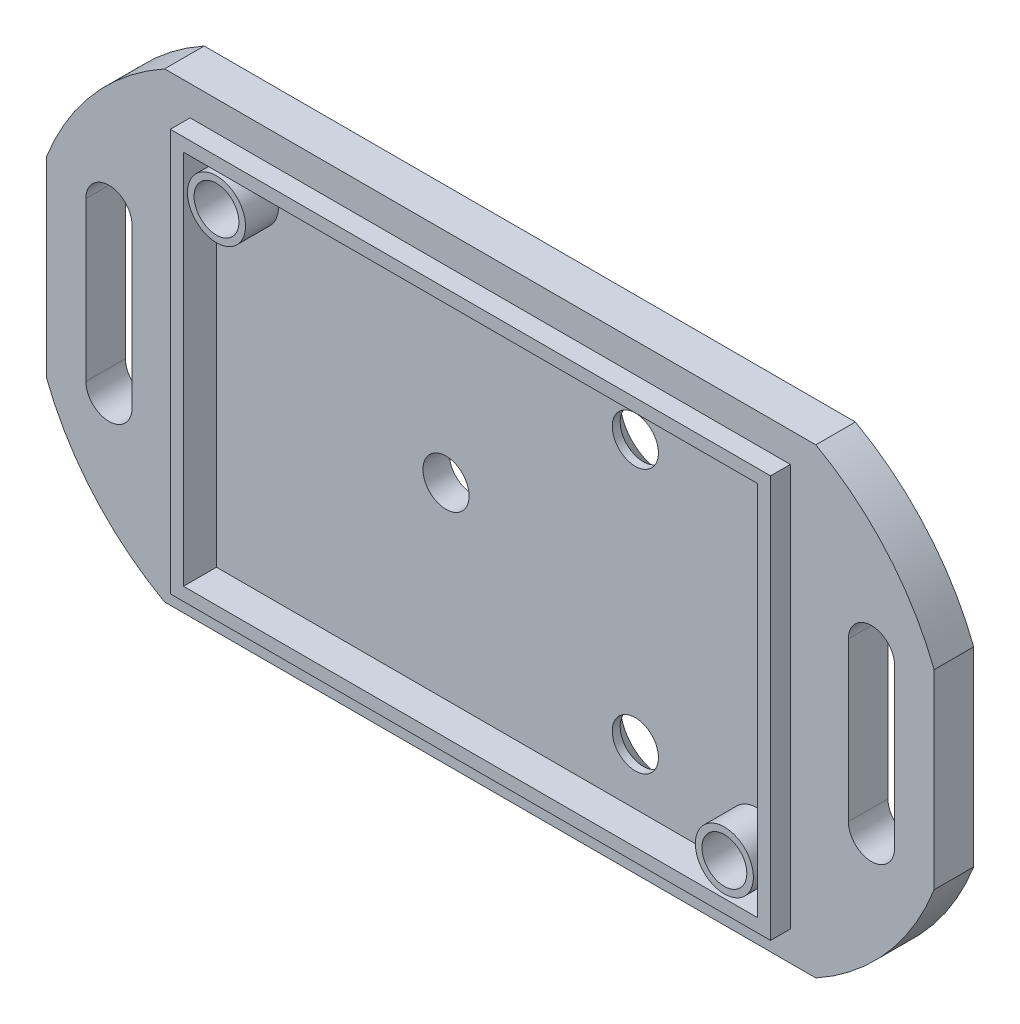
ISO-10303-21;
HEADER;
FILE_DESCRIPTION(('STEP AP214'),'2;1');
FILE_NAME('part.step','',(''),(''),'','','');
FILE_SCHEMA(('AUTOMOTIVE_DESIGN { 1 0 10303 214 1 1 1 1 }'));
ENDSEC;
DATA;
#1=APPLICATION_CONTEXT('core data for automotive mechanical design processes');
#2=APPLICATION_PROTOCOL_DEFINITION('international standard','automotive_design',2000,#1);
#3=PRODUCT_CONTEXT('',#1,'mechanical');
#4=PRODUCT('Part','Part','',(#3));
#5=PRODUCT_RELATED_PRODUCT_CATEGORY('part','',(#4));
#6=PRODUCT_DEFINITION_FORMATION('','',#4);
#7=PRODUCT_DEFINITION_CONTEXT('part definition',#1,'design');
#8=PRODUCT_DEFINITION('design','',#6,#7);
#9=PRODUCT_DEFINITION_SHAPE('','',#8);
#10=(LENGTH_UNIT() NAMED_UNIT(*) SI_UNIT(.MILLI.,.METRE.));
#11=(NAMED_UNIT(*) PLANE_ANGLE_UNIT() SI_UNIT($,.RADIAN.));
#12=(NAMED_UNIT(*) SI_UNIT($,.STERADIAN.) SOLID_ANGLE_UNIT());
#13=UNCERTAINTY_MEASURE_WITH_UNIT(LENGTH_MEASURE(1.E-05),#10,'distance_accuracy_value','');
#14=(GEOMETRIC_REPRESENTATION_CONTEXT(3) GLOBAL_UNCERTAINTY_ASSIGNED_CONTEXT((#13)) GLOBAL_UNIT_ASSIGNED_CONTEXT((#10,
#11,#12)) REPRESENTATION_CONTEXT('',''));
#15=CARTESIAN_POINT('',(0.,0.,0.));
#16=DIRECTION('',(0.,0.,1.));
#17=DIRECTION('',(1.,0.,0.));
#18=AXIS2_PLACEMENT_3D('',#15,#16,#17);
#19=CARTESIAN_POINT('',(0.,0.,2.));
#20=DIRECTION('',(0.,0.,1.));
#21=DIRECTION('',(1.,0.,0.));
#22=AXIS2_PLACEMENT_3D('',#19,#20,#21);
#23=PLANE('',#22);
#24=CARTESIAN_POINT('',(-4.34999999999999,0.,2.));
#25=DIRECTION('',(0.,0.,1.));
#26=DIRECTION('',(1.,0.,0.));
#27=AXIS2_PLACEMENT_3D('',#24,#25,#26);
#28=CIRCLE('',#27,1.75);
#29=CARTESIAN_POINT('',(-2.59999999999999,0.,2.));
#30=VERTEX_POINT('',#29);
#31=EDGE_CURVE('E427',#30,#30,#28,.T.);
#32=ORIENTED_EDGE('',*,*,#31,.F.);
#33=EDGE_LOOP('',(#32));
#34=FACE_BOUND('',#33,.T.);
#35=CARTESIAN_POINT('',(10.,-10.,2.));
#36=DIRECTION('',(0.,0.,1.));
#37=DIRECTION('',(1.,0.,0.));
#38=AXIS2_PLACEMENT_3D('',#35,#36,#37);
#39=CIRCLE('',#38,1.75);
#40=CARTESIAN_POINT('',(11.75,-10.,2.));
#41=VERTEX_POINT('',#40);
#42=EDGE_CURVE('E38',#41,#41,#39,.T.);
#43=ORIENTED_EDGE('',*,*,#42,.F.);
#44=EDGE_LOOP('',(#43));
#45=FACE_BOUND('',#44,.T.);
#46=CARTESIAN_POINT('',(10.,10.,2.));
#47=DIRECTION('',(0.,0.,1.));
#48=DIRECTION('',(1.,0.,0.));
#49=AXIS2_PLACEMENT_3D('',#46,#47,#48);
#50=CIRCLE('',#49,1.75);
#51=CARTESIAN_POINT('',(11.75,10.,2.));
#52=VERTEX_POINT('',#51);
#53=EDGE_CURVE('E405',#52,#52,#50,.T.);
#54=ORIENTED_EDGE('',*,*,#53,.F.);
#55=EDGE_LOOP('',(#54));
#56=FACE_BOUND('',#55,.T.);
#57=CARTESIAN_POINT('',(-19.25,11.75,2.));
#58=DIRECTION('',(0.,0.,1.));
#59=DIRECTION('',(1.,0.,0.));
#60=AXIS2_PLACEMENT_3D('',#57,#58,#59);
#61=CIRCLE('',#60,2.2);
#62=CARTESIAN_POINT('',(-17.05,11.75,2.));
#63=VERTEX_POINT('',#62);
#64=EDGE_CURVE('E273',#63,#63,#61,.T.);
#65=ORIENTED_EDGE('',*,*,#64,.F.);
#66=EDGE_LOOP('',(#65));
#67=FACE_BOUND('',#66,.T.);
#68=DIRECTION('',(0.,-1.,0.));
#69=VECTOR('',#68,1.);
#70=CARTESIAN_POINT('',(-21.75,14.25,2.));
#71=LINE('',#70,#69);
#72=CARTESIAN_POINT('',(-21.75,14.25,2.));
#73=VERTEX_POINT('',#72);
#74=CARTESIAN_POINT('',(-21.75,-14.25,2.));
#75=VERTEX_POINT('',#74);
#76=EDGE_CURVE('E292',#73,#75,#71,.T.);
#77=ORIENTED_EDGE('',*,*,#76,.T.);
#78=DIRECTION('',(1.,0.,0.));
#79=VECTOR('',#78,1.);
#80=CARTESIAN_POINT('',(-21.75,-14.25,2.));
#81=LINE('',#80,#79);
#82=CARTESIAN_POINT('',(21.75,-14.25,2.));
#83=VERTEX_POINT('',#82);
#84=EDGE_CURVE('E295',#75,#83,#81,.T.);
#85=ORIENTED_EDGE('',*,*,#84,.T.);
#86=DIRECTION('',(0.,1.,0.));
#87=VECTOR('',#86,1.);
#88=CARTESIAN_POINT('',(21.75,14.25,2.));
#89=LINE('',#88,#87);
#90=CARTESIAN_POINT('',(21.75,14.25,2.));
#91=VERTEX_POINT('',#90);
#92=EDGE_CURVE('E299',#83,#91,#89,.T.);
#93=ORIENTED_EDGE('',*,*,#92,.T.);
#94=DIRECTION('',(-1.,0.,0.));
#95=VECTOR('',#94,1.);
#96=CARTESIAN_POINT('',(-21.75,14.25,2.));
#97=LINE('',#96,#95);
#98=EDGE_CURVE('E302',#91,#73,#97,.T.);
#99=ORIENTED_EDGE('',*,*,#98,.T.);
#100=EDGE_LOOP('',(#77,#85,#93,#99));
#101=FACE_BOUND('',#100,.T.);
#102=CARTESIAN_POINT('',(19.25,-11.75,2.));
#103=DIRECTION('',(0.,0.,1.));
#104=DIRECTION('',(1.,0.,0.));
#105=AXIS2_PLACEMENT_3D('',#102,#103,#104);
#106=CIRCLE('',#105,2.2);
#107=CARTESIAN_POINT('',(21.45,-11.75,2.));
#108=VERTEX_POINT('',#107);
#109=EDGE_CURVE('E264',#108,#108,#106,.T.);
#110=ORIENTED_EDGE('',*,*,#109,.F.);
#111=EDGE_LOOP('',(#110));
#112=FACE_BOUND('',#111,.T.);
#113=ADVANCED_FACE('F34',(#34,#45,#56,#67,#101,#112),#23,.T.);
#114=CARTESIAN_POINT('',(15.,0.,3.));
#115=DIRECTION('',(0.,0.,1.));
#116=DIRECTION('',(1.,0.,0.));
#117=AXIS2_PLACEMENT_3D('',#114,#115,#116);
#118=PLANE('',#117);
#119=CARTESIAN_POINT('',(-28.9,6.,3.));
#120=DIRECTION('',(0.,0.,1.));
#121=DIRECTION('',(1.,0.,0.));
#122=AXIS2_PLACEMENT_3D('',#119,#120,#121);
#123=CIRCLE('',#122,1.75);
#124=CARTESIAN_POINT('',(-27.15,6.,3.));
#125=VERTEX_POINT('',#124);
#126=CARTESIAN_POINT('',(-30.65,6.,3.));
#127=VERTEX_POINT('',#126);
#128=EDGE_CURVE('E230',#125,#127,#123,.T.);
#129=ORIENTED_EDGE('',*,*,#128,.F.);
#130=DIRECTION('',(0.,1.,0.));
#131=VECTOR('',#130,1.);
#132=CARTESIAN_POINT('',(-27.15,0.,3.));
#133=LINE('',#132,#131);
#134=CARTESIAN_POINT('',(-27.15,-6.,3.));
#135=VERTEX_POINT('',#134);
#136=EDGE_CURVE('E223',#135,#125,#133,.T.);
#137=ORIENTED_EDGE('',*,*,#136,.F.);
#138=CARTESIAN_POINT('',(-28.9,-6.,3.));
#139=DIRECTION('',(0.,0.,1.));
#140=DIRECTION('',(1.,0.,0.));
#141=AXIS2_PLACEMENT_3D('',#138,#139,#140);
#142=CIRCLE('',#141,1.75);
#143=CARTESIAN_POINT('',(-30.65,-6.,3.));
#144=VERTEX_POINT('',#143);
#145=EDGE_CURVE('E203',#144,#135,#142,.T.);
#146=ORIENTED_EDGE('',*,*,#145,.F.);
#147=DIRECTION('',(0.,-1.,0.));
#148=VECTOR('',#147,1.);
#149=CARTESIAN_POINT('',(-30.65,0.,3.));
#150=LINE('',#149,#148);
#151=EDGE_CURVE('E228',#127,#144,#150,.T.);
#152=ORIENTED_EDGE('',*,*,#151,.F.);
#153=EDGE_LOOP('',(#129,#137,#146,#152));
#154=FACE_BOUND('',#153,.T.);
#155=CARTESIAN_POINT('',(28.9,6.,3.));
#156=DIRECTION('',(0.,0.,1.));
#157=DIRECTION('',(1.,0.,0.));
#158=AXIS2_PLACEMENT_3D('',#155,#156,#157);
#159=CIRCLE('',#158,1.75);
#160=CARTESIAN_POINT('',(30.65,6.,3.));
#161=VERTEX_POINT('',#160);
#162=CARTESIAN_POINT('',(27.15,6.,3.));
#163=VERTEX_POINT('',#162);
#164=EDGE_CURVE('E259',#161,#163,#159,.T.);
#165=ORIENTED_EDGE('',*,*,#164,.F.);
#166=DIRECTION('',(0.,1.,0.));
#167=VECTOR('',#166,1.);
#168=CARTESIAN_POINT('',(30.65,0.,3.));
#169=LINE('',#168,#167);
#170=CARTESIAN_POINT('',(30.65,-6.,3.));
#171=VERTEX_POINT('',#170);
#172=EDGE_CURVE('E246',#171,#161,#169,.T.);
#173=ORIENTED_EDGE('',*,*,#172,.F.);
#174=CARTESIAN_POINT('',(28.9,-6.,3.));
#175=DIRECTION('',(0.,0.,1.));
#176=DIRECTION('',(1.,0.,0.));
#177=AXIS2_PLACEMENT_3D('',#174,#175,#176);
#178=CIRCLE('',#177,1.75);
#179=CARTESIAN_POINT('',(27.15,-6.,3.));
#180=VERTEX_POINT('',#179);
#181=EDGE_CURVE('E254',#180,#171,#178,.T.);
#182=ORIENTED_EDGE('',*,*,#181,.F.);
#183=DIRECTION('',(0.,-1.,0.));
#184=VECTOR('',#183,1.);
#185=CARTESIAN_POINT('',(27.15,0.,3.));
#186=LINE('',#185,#184);
#187=EDGE_CURVE('E257',#163,#180,#186,.T.);
#188=ORIENTED_EDGE('',*,*,#187,.F.);
#189=EDGE_LOOP('',(#165,#173,#182,#188));
#190=FACE_BOUND('',#189,.T.);
#191=CARTESIAN_POINT('',(15.,0.,3.));
#192=DIRECTION('',(0.,0.,1.));
#193=DIRECTION('',(1.,0.,0.));
#194=AXIS2_PLACEMENT_3D('',#191,#192,#193);
#195=CIRCLE('',#194,20.);
#196=CARTESIAN_POINT('',(24.6824583655185,-17.5,3.));
#197=VERTEX_POINT('',#196);
#198=CARTESIAN_POINT('',(33.65,-7.22339947670067,3.));
#199=VERTEX_POINT('',#198);
#200=EDGE_CURVE('E353',#197,#199,#195,.T.);
#201=ORIENTED_EDGE('',*,*,#200,.T.);
#202=DIRECTION('',(0.,1.,0.));
#203=VECTOR('',#202,1.);
#204=CARTESIAN_POINT('',(33.65,7.22339947670068,3.));
#205=LINE('',#204,#203);
#206=CARTESIAN_POINT('',(33.65,7.22339947670068,3.));
#207=VERTEX_POINT('',#206);
#208=EDGE_CURVE('E356',#199,#207,#205,.T.);
#209=ORIENTED_EDGE('',*,*,#208,.T.);
#210=CARTESIAN_POINT('',(15.,0.,3.));
#211=DIRECTION('',(0.,0.,1.));
#212=DIRECTION('',(1.,0.,0.));
#213=AXIS2_PLACEMENT_3D('',#210,#211,#212);
#214=CIRCLE('',#213,20.);
#215=CARTESIAN_POINT('',(24.6824583655185,17.5,3.));
#216=VERTEX_POINT('',#215);
#217=EDGE_CURVE('E359',#207,#216,#214,.T.);
#218=ORIENTED_EDGE('',*,*,#217,.T.);
#219=DIRECTION('',(-1.,0.,0.));
#220=VECTOR('',#219,1.);
#221=CARTESIAN_POINT('',(-24.6824583655185,17.5,3.));
#222=LINE('',#221,#220);
#223=CARTESIAN_POINT('',(-24.6824583655185,17.5,3.));
#224=VERTEX_POINT('',#223);
#225=EDGE_CURVE('E361',#216,#224,#222,.T.);
#226=ORIENTED_EDGE('',*,*,#225,.T.);
#227=CARTESIAN_POINT('',(-15.,0.,3.));
#228=DIRECTION('',(0.,0.,1.));
#229=DIRECTION('',(1.,0.,0.));
#230=AXIS2_PLACEMENT_3D('',#227,#228,#229);
#231=CIRCLE('',#230,20.);
#232=CARTESIAN_POINT('',(-33.65,7.22339947670071,3.));
#233=VERTEX_POINT('',#232);
#234=EDGE_CURVE('E363',#224,#233,#231,.T.);
#235=ORIENTED_EDGE('',*,*,#234,.T.);
#236=DIRECTION('',(0.,-1.,0.));
#237=VECTOR('',#236,1.);
#238=CARTESIAN_POINT('',(-33.65,7.22339947670071,3.));
#239=LINE('',#238,#237);
#240=CARTESIAN_POINT('',(-33.65,-7.22339947670074,3.));
#241=VERTEX_POINT('',#240);
#242=EDGE_CURVE('E365',#233,#241,#239,.T.);
#243=ORIENTED_EDGE('',*,*,#242,.T.);
#244=CARTESIAN_POINT('',(-15.,0.,3.));
#245=DIRECTION('',(0.,0.,1.));
#246=DIRECTION('',(1.,0.,0.));
#247=AXIS2_PLACEMENT_3D('',#244,#245,#246);
#248=CIRCLE('',#247,20.);
#249=CARTESIAN_POINT('',(-24.6824583655185,-17.5,3.));
#250=VERTEX_POINT('',#249);
#251=EDGE_CURVE('E367',#241,#250,#248,.T.);
#252=ORIENTED_EDGE('',*,*,#251,.T.);
#253=DIRECTION('',(1.,0.,0.));
#254=VECTOR('',#253,1.);
#255=CARTESIAN_POINT('',(-24.6824583655185,-17.5,3.));
#256=LINE('',#255,#254);
#257=EDGE_CURVE('E369',#250,#197,#256,.T.);
#258=ORIENTED_EDGE('',*,*,#257,.T.);
#259=EDGE_LOOP('',(#201,#209,#218,#226,#235,#243,#252,#258));
#260=FACE_BOUND('',#259,.T.);
#261=DIRECTION('',(1.,0.,0.));
#262=VECTOR('',#261,1.);
#263=CARTESIAN_POINT('',(-22.75,-15.25,3.));
#264=LINE('',#263,#262);
#265=CARTESIAN_POINT('',(-22.75,-15.25,3.));
#266=VERTEX_POINT('',#265);
#267=CARTESIAN_POINT('',(22.75,-15.25,3.));
#268=VERTEX_POINT('',#267);
#269=EDGE_CURVE('E337',#266,#268,#264,.T.);
#270=ORIENTED_EDGE('',*,*,#269,.F.);
#271=DIRECTION('',(0.,-1.,0.));
#272=VECTOR('',#271,1.);
#273=CARTESIAN_POINT('',(-22.75,15.25,3.));
#274=LINE('',#273,#272);
#275=CARTESIAN_POINT('',(-22.75,15.25,3.));
#276=VERTEX_POINT('',#275);
#277=EDGE_CURVE('E317',#276,#266,#274,.T.);
#278=ORIENTED_EDGE('',*,*,#277,.F.);
#279=DIRECTION('',(-1.,0.,0.));
#280=VECTOR('',#279,1.);
#281=CARTESIAN_POINT('',(-22.75,15.25,3.));
#282=LINE('',#281,#280);
#283=CARTESIAN_POINT('',(22.75,15.25,3.));
#284=VERTEX_POINT('',#283);
#285=EDGE_CURVE('E328',#284,#276,#282,.T.);
#286=ORIENTED_EDGE('',*,*,#285,.F.);
#287=DIRECTION('',(0.,1.,0.));
#288=VECTOR('',#287,1.);
#289=CARTESIAN_POINT('',(22.75,15.25,3.));
#290=LINE('',#289,#288);
#291=EDGE_CURVE('E339',#268,#284,#290,.T.);
#292=ORIENTED_EDGE('',*,*,#291,.F.);
#293=EDGE_LOOP('',(#270,#278,#286,#292));
#294=FACE_BOUND('',#293,.T.);
#295=ADVANCED_FACE('F436',(#154,#190,#260,#294),#118,.T.);
#296=CARTESIAN_POINT('',(15.,0.,3.));
#297=DIRECTION('',(0.,0.,-1.));
#298=DIRECTION('',(-1.,0.,0.));
#299=AXIS2_PLACEMENT_3D('',#296,#297,#298);
#300=CYLINDRICAL_SURFACE('',#299,20.);
#301=CARTESIAN_POINT('',(15.,0.,0.));
#302=DIRECTION('',(0.,0.,1.));
#303=DIRECTION('',(1.,0.,0.));
#304=AXIS2_PLACEMENT_3D('',#301,#302,#303);
#305=CIRCLE('',#304,20.);
#306=CARTESIAN_POINT('',(24.6824583655185,-17.5,0.));
#307=VERTEX_POINT('',#306);
#308=CARTESIAN_POINT('',(33.65,-7.22339947670067,0.));
#309=VERTEX_POINT('',#308);
#310=EDGE_CURVE('E352',#307,#309,#305,.T.);
#311=ORIENTED_EDGE('',*,*,#310,.T.);
#312=DIRECTION('',(0.,0.,-1.));
#313=VECTOR('',#312,1.);
#314=CARTESIAN_POINT('',(33.65,-7.22339947670067,3.));
#315=LINE('',#314,#313);
#316=EDGE_CURVE('E11',#199,#309,#315,.T.);
#317=ORIENTED_EDGE('',*,*,#316,.F.);
#318=ORIENTED_EDGE('',*,*,#200,.F.);
#319=DIRECTION('',(0.,0.,-1.));
#320=VECTOR('',#319,1.);
#321=CARTESIAN_POINT('',(24.6824583655185,-17.5,3.));
#322=LINE('',#321,#320);
#323=EDGE_CURVE('E371',#197,#307,#322,.T.);
#324=ORIENTED_EDGE('',*,*,#323,.T.);
#325=EDGE_LOOP('',(#311,#317,#318,#324));
#326=FACE_BOUND('',#325,.T.);
#327=ADVANCED_FACE('F36',(#326),#300,.T.);
#328=CARTESIAN_POINT('',(33.65,7.22339947670068,3.));
#329=DIRECTION('',(-1.,0.,0.));
#330=DIRECTION('',(0.,0.,1.));
#331=AXIS2_PLACEMENT_3D('',#328,#329,#330);
#332=PLANE('',#331);
#333=DIRECTION('',(0.,1.,0.));
#334=VECTOR('',#333,1.);
#335=CARTESIAN_POINT('',(33.65,7.22339947670068,0.));
#336=LINE('',#335,#334);
#337=CARTESIAN_POINT('',(33.65,7.22339947670068,0.));
#338=VERTEX_POINT('',#337);
#339=EDGE_CURVE('E374',#309,#338,#336,.T.);
#340=ORIENTED_EDGE('',*,*,#339,.T.);
#341=DIRECTION('',(0.,0.,-1.));
#342=VECTOR('',#341,1.);
#343=CARTESIAN_POINT('',(33.65,7.22339947670068,3.));
#344=LINE('',#343,#342);
#345=EDGE_CURVE('E43',#207,#338,#344,.T.);
#346=ORIENTED_EDGE('',*,*,#345,.F.);
#347=ORIENTED_EDGE('',*,*,#208,.F.);
#348=ORIENTED_EDGE('',*,*,#316,.T.);
#349=EDGE_LOOP('',(#340,#346,#347,#348));
#350=FACE_BOUND('',#349,.T.);
#351=ADVANCED_FACE('F553',(#350),#332,.F.);
#352=CARTESIAN_POINT('',(15.,0.,3.));
#353=DIRECTION('',(0.,0.,-1.));
#354=DIRECTION('',(-1.,0.,0.));
#355=AXIS2_PLACEMENT_3D('',#352,#353,#354);
#356=CYLINDRICAL_SURFACE('',#355,20.);
#357=CARTESIAN_POINT('',(15.,0.,0.));
#358=DIRECTION('',(0.,0.,1.));
#359=DIRECTION('',(1.,0.,0.));
#360=AXIS2_PLACEMENT_3D('',#357,#358,#359);
#361=CIRCLE('',#360,20.);
#362=CARTESIAN_POINT('',(24.6824583655185,17.5,0.));
#363=VERTEX_POINT('',#362);
#364=EDGE_CURVE('E376',#338,#363,#361,.T.);
#365=ORIENTED_EDGE('',*,*,#364,.T.);
#366=DIRECTION('',(0.,0.,-1.));
#367=VECTOR('',#366,1.);
#368=CARTESIAN_POINT('',(24.6824583655185,17.5,3.));
#369=LINE('',#368,#367);
#370=EDGE_CURVE('E401',#216,#363,#369,.T.);
#371=ORIENTED_EDGE('',*,*,#370,.F.);
#372=ORIENTED_EDGE('',*,*,#217,.F.);
#373=ORIENTED_EDGE('',*,*,#345,.T.);
#374=EDGE_LOOP('',(#365,#371,#372,#373));
#375=FACE_BOUND('',#374,.T.);
#376=ADVANCED_FACE('F550',(#375),#356,.T.);
#377=CARTESIAN_POINT('',(-24.6824583655185,17.5,3.));
#378=DIRECTION('',(0.,-1.,0.));
#379=DIRECTION('',(0.,0.,-1.));
#380=AXIS2_PLACEMENT_3D('',#377,#378,#379);
#381=PLANE('',#380);
#382=DIRECTION('',(-1.,0.,0.));
#383=VECTOR('',#382,1.);
#384=CARTESIAN_POINT('',(-24.6824583655185,17.5,0.));
#385=LINE('',#384,#383);
#386=CARTESIAN_POINT('',(-24.6824583655185,17.5,0.));
#387=VERTEX_POINT('',#386);
#388=EDGE_CURVE('E378',#363,#387,#385,.T.);
#389=ORIENTED_EDGE('',*,*,#388,.T.);
#390=DIRECTION('',(0.,0.,-1.));
#391=VECTOR('',#390,1.);
#392=CARTESIAN_POINT('',(-24.6824583655185,17.5,3.));
#393=LINE('',#392,#391);
#394=EDGE_CURVE('E398',#224,#387,#393,.T.);
#395=ORIENTED_EDGE('',*,*,#394,.F.);
#396=ORIENTED_EDGE('',*,*,#225,.F.);
#397=ORIENTED_EDGE('',*,*,#370,.T.);
#398=EDGE_LOOP('',(#389,#395,#396,#397));
#399=FACE_BOUND('',#398,.T.);
#400=ADVANCED_FACE('F546',(#399),#381,.F.);
#401=CARTESIAN_POINT('',(-15.,0.,3.));
#402=DIRECTION('',(0.,0.,-1.));
#403=DIRECTION('',(-1.,0.,0.));
#404=AXIS2_PLACEMENT_3D('',#401,#402,#403);
#405=CYLINDRICAL_SURFACE('',#404,20.);
#406=CARTESIAN_POINT('',(-15.,0.,0.));
#407=DIRECTION('',(0.,0.,1.));
#408=DIRECTION('',(1.,0.,0.));
#409=AXIS2_PLACEMENT_3D('',#406,#407,#408);
#410=CIRCLE('',#409,20.);
#411=CARTESIAN_POINT('',(-33.65,7.22339947670071,0.));
#412=VERTEX_POINT('',#411);
#413=EDGE_CURVE('E380',#387,#412,#410,.T.);
#414=ORIENTED_EDGE('',*,*,#413,.T.);
#415=DIRECTION('',(0.,0.,-1.));
#416=VECTOR('',#415,1.);
#417=CARTESIAN_POINT('',(-33.65,7.22339947670071,3.));
#418=LINE('',#417,#416);
#419=EDGE_CURVE('E395',#233,#412,#418,.T.);
#420=ORIENTED_EDGE('',*,*,#419,.F.);
#421=ORIENTED_EDGE('',*,*,#234,.F.);
#422=ORIENTED_EDGE('',*,*,#394,.T.);
#423=EDGE_LOOP('',(#414,#420,#421,#422));
#424=FACE_BOUND('',#423,.T.);
#425=ADVANCED_FACE('F542',(#424),#405,.T.);
#426=CARTESIAN_POINT('',(-33.65,7.22339947670071,3.));
#427=DIRECTION('',(1.,0.,0.));
#428=DIRECTION('',(0.,1.,0.));
#429=AXIS2_PLACEMENT_3D('',#426,#427,#428);
#430=PLANE('',#429);
#431=DIRECTION('',(0.,-1.,0.));
#432=VECTOR('',#431,1.);
#433=CARTESIAN_POINT('',(-33.65,7.22339947670071,0.));
#434=LINE('',#433,#432);
#435=CARTESIAN_POINT('',(-33.65,-7.22339947670074,0.));
#436=VERTEX_POINT('',#435);
#437=EDGE_CURVE('E382',#412,#436,#434,.T.);
#438=ORIENTED_EDGE('',*,*,#437,.T.);
#439=DIRECTION('',(0.,0.,-1.));
#440=VECTOR('',#439,1.);
#441=CARTESIAN_POINT('',(-33.65,-7.22339947670074,3.));
#442=LINE('',#441,#440);
#443=EDGE_CURVE('E392',#241,#436,#442,.T.);
#444=ORIENTED_EDGE('',*,*,#443,.F.);
#445=ORIENTED_EDGE('',*,*,#242,.F.);
#446=ORIENTED_EDGE('',*,*,#419,.T.);
#447=EDGE_LOOP('',(#438,#444,#445,#446));
#448=FACE_BOUND('',#447,.T.);
#449=ADVANCED_FACE('F538',(#448),#430,.F.);
#450=CARTESIAN_POINT('',(-15.,0.,3.));
#451=DIRECTION('',(0.,0.,-1.));
#452=DIRECTION('',(-1.,0.,0.));
#453=AXIS2_PLACEMENT_3D('',#450,#451,#452);
#454=CYLINDRICAL_SURFACE('',#453,20.);
#455=CARTESIAN_POINT('',(-15.,0.,0.));
#456=DIRECTION('',(0.,0.,1.));
#457=DIRECTION('',(1.,0.,0.));
#458=AXIS2_PLACEMENT_3D('',#455,#456,#457);
#459=CIRCLE('',#458,20.);
#460=CARTESIAN_POINT('',(-24.6824583655185,-17.5,0.));
#461=VERTEX_POINT('',#460);
#462=EDGE_CURVE('E384',#436,#461,#459,.T.);
#463=ORIENTED_EDGE('',*,*,#462,.T.);
#464=DIRECTION('',(0.,0.,-1.));
#465=VECTOR('',#464,1.);
#466=CARTESIAN_POINT('',(-24.6824583655185,-17.5,3.));
#467=LINE('',#466,#465);
#468=EDGE_CURVE('E389',#250,#461,#467,.T.);
#469=ORIENTED_EDGE('',*,*,#468,.F.);
#470=ORIENTED_EDGE('',*,*,#251,.F.);
#471=ORIENTED_EDGE('',*,*,#443,.T.);
#472=EDGE_LOOP('',(#463,#469,#470,#471));
#473=FACE_BOUND('',#472,.T.);
#474=ADVANCED_FACE('F534',(#473),#454,.T.);
#475=CARTESIAN_POINT('',(-24.6824583655185,-17.5,3.));
#476=DIRECTION('',(0.,1.,0.));
#477=DIRECTION('',(0.,0.,1.));
#478=AXIS2_PLACEMENT_3D('',#475,#476,#477);
#479=PLANE('',#478);
#480=DIRECTION('',(1.,0.,0.));
#481=VECTOR('',#480,1.);
#482=CARTESIAN_POINT('',(-24.6824583655185,-17.5,0.));
#483=LINE('',#482,#481);
#484=EDGE_CURVE('E357',#461,#307,#483,.T.);
#485=ORIENTED_EDGE('',*,*,#484,.T.);
#486=ORIENTED_EDGE('',*,*,#323,.F.);
#487=ORIENTED_EDGE('',*,*,#257,.F.);
#488=ORIENTED_EDGE('',*,*,#468,.T.);
#489=EDGE_LOOP('',(#485,#486,#487,#488));
#490=FACE_BOUND('',#489,.T.);
#491=ADVANCED_FACE('F530',(#490),#479,.F.);
#492=CARTESIAN_POINT('',(15.,0.,0.));
#493=DIRECTION('',(0.,0.,1.));
#494=DIRECTION('',(1.,0.,0.));
#495=AXIS2_PLACEMENT_3D('',#492,#493,#494);
#496=PLANE('',#495);
#497=CARTESIAN_POINT('',(-4.34999999999999,0.,0.));
#498=DIRECTION('',(0.,0.,1.));
#499=DIRECTION('',(1.,0.,0.));
#500=AXIS2_PLACEMENT_3D('',#497,#498,#499);
#501=CIRCLE('',#500,1.75);
#502=CARTESIAN_POINT('',(-2.59999999999999,0.,0.));
#503=VERTEX_POINT('',#502);
#504=EDGE_CURVE('E424',#503,#503,#501,.F.);
#505=ORIENTED_EDGE('',*,*,#504,.F.);
#506=EDGE_LOOP('',(#505));
#507=FACE_BOUND('',#506,.T.);
#508=CARTESIAN_POINT('',(10.,-10.,0.));
#509=DIRECTION('',(0.,0.,-1.));
#510=DIRECTION('',(-1.,0.,0.));
#511=AXIS2_PLACEMENT_3D('',#508,#509,#510);
#512=CIRCLE('',#511,3.15);
#513=CARTESIAN_POINT('',(6.85,-10.,0.));
#514=VERTEX_POINT('',#513);
#515=EDGE_CURVE('E421',#514,#514,#512,.T.);
#516=ORIENTED_EDGE('',*,*,#515,.F.);
#517=EDGE_LOOP('',(#516));
#518=FACE_BOUND('',#517,.T.);
#519=CARTESIAN_POINT('',(10.,10.,0.));
#520=DIRECTION('',(0.,0.,-1.));
#521=DIRECTION('',(-1.,0.,0.));
#522=AXIS2_PLACEMENT_3D('',#519,#520,#521);
#523=CIRCLE('',#522,3.15);
#524=CARTESIAN_POINT('',(6.85,10.,0.));
#525=VERTEX_POINT('',#524);
#526=EDGE_CURVE('E411',#525,#525,#523,.T.);
#527=ORIENTED_EDGE('',*,*,#526,.F.);
#528=EDGE_LOOP('',(#527));
#529=FACE_BOUND('',#528,.T.);
#530=DIRECTION('',(0.,-1.,0.));
#531=VECTOR('',#530,1.);
#532=CARTESIAN_POINT('',(-27.15,6.,0.));
#533=LINE('',#532,#531);
#534=CARTESIAN_POINT('',(-27.15,6.,0.));
#535=VERTEX_POINT('',#534);
#536=CARTESIAN_POINT('',(-27.15,-6.,0.));
#537=VERTEX_POINT('',#536);
#538=EDGE_CURVE('E209',#535,#537,#533,.T.);
#539=ORIENTED_EDGE('',*,*,#538,.F.);
#540=CARTESIAN_POINT('',(-28.9,6.,0.));
#541=DIRECTION('',(0.,0.,-1.));
#542=DIRECTION('',(-1.,0.,0.));
#543=AXIS2_PLACEMENT_3D('',#540,#541,#542);
#544=CIRCLE('',#543,1.75);
#545=CARTESIAN_POINT('',(-30.65,6.,0.));
#546=VERTEX_POINT('',#545);
#547=EDGE_CURVE('E59',#546,#535,#544,.T.);
#548=ORIENTED_EDGE('',*,*,#547,.F.);
#549=DIRECTION('',(0.,1.,0.));
#550=VECTOR('',#549,1.);
#551=CARTESIAN_POINT('',(-30.65,6.,0.));
#552=LINE('',#551,#550);
#553=CARTESIAN_POINT('',(-30.65,-6.,0.));
#554=VERTEX_POINT('',#553);
#555=EDGE_CURVE('E216',#554,#546,#552,.T.);
#556=ORIENTED_EDGE('',*,*,#555,.F.);
#557=CARTESIAN_POINT('',(-28.9,-6.,0.));
#558=DIRECTION('',(0.,0.,-1.));
#559=DIRECTION('',(-1.,0.,0.));
#560=AXIS2_PLACEMENT_3D('',#557,#558,#559);
#561=CIRCLE('',#560,1.75);
#562=EDGE_CURVE('E200',#537,#554,#561,.T.);
#563=ORIENTED_EDGE('',*,*,#562,.F.);
#564=EDGE_LOOP('',(#539,#548,#556,#563));
#565=FACE_BOUND('',#564,.T.);
#566=DIRECTION('',(0.,-1.,0.));
#567=VECTOR('',#566,1.);
#568=CARTESIAN_POINT('',(30.65,6.,0.));
#569=LINE('',#568,#567);
#570=CARTESIAN_POINT('',(30.65,6.,0.));
#571=VERTEX_POINT('',#570);
#572=CARTESIAN_POINT('',(30.65,-6.,0.));
#573=VERTEX_POINT('',#572);
#574=EDGE_CURVE('E234',#571,#573,#569,.T.);
#575=ORIENTED_EDGE('',*,*,#574,.F.);
#576=CARTESIAN_POINT('',(28.9,6.,0.));
#577=DIRECTION('',(0.,0.,-1.));
#578=DIRECTION('',(-1.,0.,0.));
#579=AXIS2_PLACEMENT_3D('',#576,#577,#578);
#580=CIRCLE('',#579,1.75);
#581=CARTESIAN_POINT('',(27.15,6.,0.));
#582=VERTEX_POINT('',#581);
#583=EDGE_CURVE('E232',#582,#571,#580,.T.);
#584=ORIENTED_EDGE('',*,*,#583,.F.);
#585=DIRECTION('',(0.,1.,0.));
#586=VECTOR('',#585,1.);
#587=CARTESIAN_POINT('',(27.15,6.,0.));
#588=LINE('',#587,#586);
#589=CARTESIAN_POINT('',(27.15,-6.,0.));
#590=VERTEX_POINT('',#589);
#591=EDGE_CURVE('E240',#590,#582,#588,.T.);
#592=ORIENTED_EDGE('',*,*,#591,.F.);
#593=CARTESIAN_POINT('',(28.9,-6.,0.));
#594=DIRECTION('',(0.,0.,-1.));
#595=DIRECTION('',(-1.,0.,0.));
#596=AXIS2_PLACEMENT_3D('',#593,#594,#595);
#597=CIRCLE('',#596,1.75);
#598=EDGE_CURVE('E237',#573,#590,#597,.T.);
#599=ORIENTED_EDGE('',*,*,#598,.F.);
#600=EDGE_LOOP('',(#575,#584,#592,#599));
#601=FACE_BOUND('',#600,.T.);
#602=CARTESIAN_POINT('',(19.25,-11.75,0.));
#603=DIRECTION('',(0.,0.,-1.));
#604=DIRECTION('',(-1.,0.,0.));
#605=AXIS2_PLACEMENT_3D('',#602,#603,#604);
#606=CIRCLE('',#605,3.15);
#607=CARTESIAN_POINT('',(16.1,-11.75,0.));
#608=VERTEX_POINT('',#607);
#609=EDGE_CURVE('E277',#608,#608,#606,.T.);
#610=ORIENTED_EDGE('',*,*,#609,.F.);
#611=EDGE_LOOP('',(#610));
#612=FACE_BOUND('',#611,.T.);
#613=CARTESIAN_POINT('',(-19.25,11.75,0.));
#614=DIRECTION('',(0.,0.,-1.));
#615=DIRECTION('',(-1.,0.,0.));
#616=AXIS2_PLACEMENT_3D('',#613,#614,#615);
#617=CIRCLE('',#616,3.15);
#618=CARTESIAN_POINT('',(-22.4,11.75,0.));
#619=VERTEX_POINT('',#618);
#620=EDGE_CURVE('E285',#619,#619,#617,.T.);
#621=ORIENTED_EDGE('',*,*,#620,.F.);
#622=EDGE_LOOP('',(#621));
#623=FACE_BOUND('',#622,.T.);
#624=ORIENTED_EDGE('',*,*,#310,.F.);
#625=ORIENTED_EDGE('',*,*,#484,.F.);
#626=ORIENTED_EDGE('',*,*,#462,.F.);
#627=ORIENTED_EDGE('',*,*,#437,.F.);
#628=ORIENTED_EDGE('',*,*,#413,.F.);
#629=ORIENTED_EDGE('',*,*,#388,.F.);
#630=ORIENTED_EDGE('',*,*,#364,.F.);
#631=ORIENTED_EDGE('',*,*,#339,.F.);
#632=EDGE_LOOP('',(#624,#625,#626,#627,#628,#629,#630,#631));
#633=FACE_BOUND('',#632,.T.);
#634=ADVANCED_FACE('F213',(#507,#518,#529,#565,#601,#612,#623,#633),#496,.F.);
#635=CARTESIAN_POINT('',(-22.75,15.25,4.5));
#636=DIRECTION('',(1.,0.,0.));
#637=DIRECTION('',(0.,1.,0.));
#638=AXIS2_PLACEMENT_3D('',#635,#636,#637);
#639=PLANE('',#638);
#640=ORIENTED_EDGE('',*,*,#277,.T.);
#641=DIRECTION('',(0.,0.,-1.));
#642=VECTOR('',#641,1.);
#643=CARTESIAN_POINT('',(-22.75,-15.25,4.5));
#644=LINE('',#643,#642);
#645=CARTESIAN_POINT('',(-22.75,-15.25,4.5));
#646=VERTEX_POINT('',#645);
#647=EDGE_CURVE('E350',#646,#266,#644,.T.);
#648=ORIENTED_EDGE('',*,*,#647,.F.);
#649=DIRECTION('',(0.,-1.,0.));
#650=VECTOR('',#649,1.);
#651=CARTESIAN_POINT('',(-22.75,15.25,4.5));
#652=LINE('',#651,#650);
#653=CARTESIAN_POINT('',(-22.75,15.25,4.5));
#654=VERTEX_POINT('',#653);
#655=EDGE_CURVE('E324',#654,#646,#652,.T.);
#656=ORIENTED_EDGE('',*,*,#655,.F.);
#657=DIRECTION('',(0.,0.,-1.));
#658=VECTOR('',#657,1.);
#659=CARTESIAN_POINT('',(-22.75,15.25,4.5));
#660=LINE('',#659,#658);
#661=EDGE_CURVE('E334',#654,#276,#660,.T.);
#662=ORIENTED_EDGE('',*,*,#661,.T.);
#663=EDGE_LOOP('',(#640,#648,#656,#662));
#664=FACE_BOUND('',#663,.T.);
#665=ADVANCED_FACE('F520',(#664),#639,.F.);
#666=CARTESIAN_POINT('',(-22.75,-15.25,4.5));
#667=DIRECTION('',(0.,1.,0.));
#668=DIRECTION('',(0.,0.,1.));
#669=AXIS2_PLACEMENT_3D('',#666,#667,#668);
#670=PLANE('',#669);
#671=ORIENTED_EDGE('',*,*,#269,.T.);
#672=DIRECTION('',(0.,0.,-1.));
#673=VECTOR('',#672,1.);
#674=CARTESIAN_POINT('',(22.75,-15.25,4.5));
#675=LINE('',#674,#673);
#676=CARTESIAN_POINT('',(22.75,-15.25,4.5));
#677=VERTEX_POINT('',#676);
#678=EDGE_CURVE('E347',#677,#268,#675,.T.);
#679=ORIENTED_EDGE('',*,*,#678,.F.);
#680=DIRECTION('',(1.,0.,0.));
#681=VECTOR('',#680,1.);
#682=CARTESIAN_POINT('',(-22.75,-15.25,4.5));
#683=LINE('',#682,#681);
#684=EDGE_CURVE('E327',#646,#677,#683,.T.);
#685=ORIENTED_EDGE('',*,*,#684,.F.);
#686=ORIENTED_EDGE('',*,*,#647,.T.);
#687=EDGE_LOOP('',(#671,#679,#685,#686));
#688=FACE_BOUND('',#687,.T.);
#689=ADVANCED_FACE('F516',(#688),#670,.F.);
#690=CARTESIAN_POINT('',(22.75,15.25,4.5));
#691=DIRECTION('',(-1.,0.,0.));
#692=DIRECTION('',(0.,0.,1.));
#693=AXIS2_PLACEMENT_3D('',#690,#691,#692);
#694=PLANE('',#693);
#695=ORIENTED_EDGE('',*,*,#291,.T.);
#696=DIRECTION('',(0.,0.,-1.));
#697=VECTOR('',#696,1.);
#698=CARTESIAN_POINT('',(22.75,15.25,4.5));
#699=LINE('',#698,#697);
#700=CARTESIAN_POINT('',(22.75,15.25,4.5));
#701=VERTEX_POINT('',#700);
#702=EDGE_CURVE('E345',#701,#284,#699,.T.);
#703=ORIENTED_EDGE('',*,*,#702,.F.);
#704=DIRECTION('',(0.,1.,0.));
#705=VECTOR('',#704,1.);
#706=CARTESIAN_POINT('',(22.75,15.25,4.5));
#707=LINE('',#706,#705);
#708=EDGE_CURVE('E330',#677,#701,#707,.T.);
#709=ORIENTED_EDGE('',*,*,#708,.F.);
#710=ORIENTED_EDGE('',*,*,#678,.T.);
#711=EDGE_LOOP('',(#695,#703,#709,#710));
#712=FACE_BOUND('',#711,.T.);
#713=ADVANCED_FACE('F512',(#712),#694,.F.);
#714=CARTESIAN_POINT('',(-22.75,15.25,4.5));
#715=DIRECTION('',(0.,-1.,0.));
#716=DIRECTION('',(0.,0.,-1.));
#717=AXIS2_PLACEMENT_3D('',#714,#715,#716);
#718=PLANE('',#717);
#719=ORIENTED_EDGE('',*,*,#285,.T.);
#720=ORIENTED_EDGE('',*,*,#661,.F.);
#721=DIRECTION('',(-1.,0.,0.));
#722=VECTOR('',#721,1.);
#723=CARTESIAN_POINT('',(-22.75,15.25,4.5));
#724=LINE('',#723,#722);
#725=EDGE_CURVE('E332',#701,#654,#724,.T.);
#726=ORIENTED_EDGE('',*,*,#725,.F.);
#727=ORIENTED_EDGE('',*,*,#702,.T.);
#728=EDGE_LOOP('',(#719,#720,#726,#727));
#729=FACE_BOUND('',#728,.T.);
#730=ADVANCED_FACE('F508',(#729),#718,.F.);
#731=CARTESIAN_POINT('',(0.,0.,4.5));
#732=DIRECTION('',(0.,0.,1.));
#733=DIRECTION('',(1.,0.,0.));
#734=AXIS2_PLACEMENT_3D('',#731,#732,#733);
#735=PLANE('',#734);
#736=DIRECTION('',(0.,-1.,0.));
#737=VECTOR('',#736,1.);
#738=CARTESIAN_POINT('',(-21.75,14.25,4.5));
#739=LINE('',#738,#737);
#740=CARTESIAN_POINT('',(-21.75,14.25,4.5));
#741=VERTEX_POINT('',#740);
#742=CARTESIAN_POINT('',(-21.75,-14.25,4.5));
#743=VERTEX_POINT('',#742);
#744=EDGE_CURVE('E291',#741,#743,#739,.T.);
#745=ORIENTED_EDGE('',*,*,#744,.F.);
#746=DIRECTION('',(-1.,0.,0.));
#747=VECTOR('',#746,1.);
#748=CARTESIAN_POINT('',(-21.75,14.25,4.5));
#749=LINE('',#748,#747);
#750=CARTESIAN_POINT('',(21.75,14.25,4.5));
#751=VERTEX_POINT('',#750);
#752=EDGE_CURVE('E296',#751,#741,#749,.T.);
#753=ORIENTED_EDGE('',*,*,#752,.F.);
#754=DIRECTION('',(0.,1.,0.));
#755=VECTOR('',#754,1.);
#756=CARTESIAN_POINT('',(21.75,14.25,4.5));
#757=LINE('',#756,#755);
#758=CARTESIAN_POINT('',(21.75,-14.25,4.5));
#759=VERTEX_POINT('',#758);
#760=EDGE_CURVE('E310',#759,#751,#757,.T.);
#761=ORIENTED_EDGE('',*,*,#760,.F.);
#762=DIRECTION('',(1.,0.,0.));
#763=VECTOR('',#762,1.);
#764=CARTESIAN_POINT('',(-21.75,-14.25,4.5));
#765=LINE('',#764,#763);
#766=EDGE_CURVE('E307',#743,#759,#765,.T.);
#767=ORIENTED_EDGE('',*,*,#766,.F.);
#768=EDGE_LOOP('',(#745,#753,#761,#767));
#769=FACE_BOUND('',#768,.T.);
#770=ORIENTED_EDGE('',*,*,#655,.T.);
#771=ORIENTED_EDGE('',*,*,#684,.T.);
#772=ORIENTED_EDGE('',*,*,#708,.T.);
#773=ORIENTED_EDGE('',*,*,#725,.T.);
#774=EDGE_LOOP('',(#770,#771,#772,#773));
#775=FACE_BOUND('',#774,.T.);
#776=ADVANCED_FACE('F504',(#769,#775),#735,.T.);
#777=CARTESIAN_POINT('',(-21.75,14.25,2.));
#778=DIRECTION('',(-1.,0.,0.));
#779=DIRECTION('',(0.,0.,1.));
#780=AXIS2_PLACEMENT_3D('',#777,#778,#779);
#781=PLANE('',#780);
#782=ORIENTED_EDGE('',*,*,#744,.T.);
#783=DIRECTION('',(0.,0.,1.));
#784=VECTOR('',#783,1.);
#785=CARTESIAN_POINT('',(-21.75,-14.25,2.));
#786=LINE('',#785,#784);
#787=EDGE_CURVE('E305',#75,#743,#786,.T.);
#788=ORIENTED_EDGE('',*,*,#787,.F.);
#789=ORIENTED_EDGE('',*,*,#76,.F.);
#790=DIRECTION('',(0.,0.,1.));
#791=VECTOR('',#790,1.);
#792=CARTESIAN_POINT('',(-21.75,14.25,2.));
#793=LINE('',#792,#791);
#794=EDGE_CURVE('E315',#73,#741,#793,.T.);
#795=ORIENTED_EDGE('',*,*,#794,.T.);
#796=EDGE_LOOP('',(#782,#788,#789,#795));
#797=FACE_BOUND('',#796,.T.);
#798=ADVANCED_FACE('F494',(#797),#781,.F.);
#799=CARTESIAN_POINT('',(-21.75,14.25,2.));
#800=DIRECTION('',(0.,1.,0.));
#801=DIRECTION('',(0.,0.,1.));
#802=AXIS2_PLACEMENT_3D('',#799,#800,#801);
#803=PLANE('',#802);
#804=ORIENTED_EDGE('',*,*,#752,.T.);
#805=ORIENTED_EDGE('',*,*,#794,.F.);
#806=ORIENTED_EDGE('',*,*,#98,.F.);
#807=DIRECTION('',(0.,0.,1.));
#808=VECTOR('',#807,1.);
#809=CARTESIAN_POINT('',(21.75,14.25,2.));
#810=LINE('',#809,#808);
#811=EDGE_CURVE('E318',#91,#751,#810,.T.);
#812=ORIENTED_EDGE('',*,*,#811,.T.);
#813=EDGE_LOOP('',(#804,#805,#806,#812));
#814=FACE_BOUND('',#813,.T.);
#815=ADVANCED_FACE('F490',(#814),#803,.F.);
#816=CARTESIAN_POINT('',(21.75,14.25,2.));
#817=DIRECTION('',(1.,0.,0.));
#818=DIRECTION('',(0.,1.,0.));
#819=AXIS2_PLACEMENT_3D('',#816,#817,#818);
#820=PLANE('',#819);
#821=ORIENTED_EDGE('',*,*,#760,.T.);
#822=ORIENTED_EDGE('',*,*,#811,.F.);
#823=ORIENTED_EDGE('',*,*,#92,.F.);
#824=DIRECTION('',(0.,0.,1.));
#825=VECTOR('',#824,1.);
#826=CARTESIAN_POINT('',(21.75,-14.25,2.));
#827=LINE('',#826,#825);
#828=EDGE_CURVE('E320',#83,#759,#827,.T.);
#829=ORIENTED_EDGE('',*,*,#828,.T.);
#830=EDGE_LOOP('',(#821,#822,#823,#829));
#831=FACE_BOUND('',#830,.T.);
#832=ADVANCED_FACE('F493',(#831),#820,.F.);
#833=CARTESIAN_POINT('',(-21.75,-14.25,2.));
#834=DIRECTION('',(0.,-1.,0.));
#835=DIRECTION('',(0.,0.,-1.));
#836=AXIS2_PLACEMENT_3D('',#833,#834,#835);
#837=PLANE('',#836);
#838=ORIENTED_EDGE('',*,*,#766,.T.);
#839=ORIENTED_EDGE('',*,*,#828,.F.);
#840=ORIENTED_EDGE('',*,*,#84,.F.);
#841=ORIENTED_EDGE('',*,*,#787,.T.);
#842=EDGE_LOOP('',(#838,#839,#840,#841));
#843=FACE_BOUND('',#842,.T.);
#844=ADVANCED_FACE('F487',(#843),#837,.F.);
#845=CARTESIAN_POINT('',(-19.25,11.75,0.));
#846=DIRECTION('',(0.,0.,-1.));
#847=DIRECTION('',(-1.,0.,0.));
#848=AXIS2_PLACEMENT_3D('',#845,#846,#847);
#849=CYLINDRICAL_SURFACE('',#848,1.7);
#850=CARTESIAN_POINT('',(-19.25,11.75,1.45));
#851=DIRECTION('',(0.,0.,-1.));
#852=DIRECTION('',(-1.,0.,0.));
#853=AXIS2_PLACEMENT_3D('',#850,#851,#852);
#854=CIRCLE('',#853,1.7);
#855=CARTESIAN_POINT('',(-20.95,11.75,1.45));
#856=VERTEX_POINT('',#855);
#857=EDGE_CURVE('E288',#856,#856,#854,.T.);
#858=ORIENTED_EDGE('',*,*,#857,.T.);
#859=EDGE_LOOP('',(#858));
#860=FACE_BOUND('',#859,.T.);
#861=CARTESIAN_POINT('',(-19.25,11.75,4.5));
#862=DIRECTION('',(0.,0.,1.));
#863=DIRECTION('',(1.,0.,0.));
#864=AXIS2_PLACEMENT_3D('',#861,#862,#863);
#865=CIRCLE('',#864,1.7);
#866=CARTESIAN_POINT('',(-17.55,11.75,4.5));
#867=VERTEX_POINT('',#866);
#868=EDGE_CURVE('E268',#867,#867,#865,.T.);
#869=ORIENTED_EDGE('',*,*,#868,.T.);
#870=EDGE_LOOP('',(#869));
#871=FACE_BOUND('',#870,.T.);
#872=ADVANCED_FACE('F484',(#860,#871),#849,.F.);
#873=CARTESIAN_POINT('',(-19.25,11.75,0.));
#874=DIRECTION('',(0.,0.,-1.));
#875=DIRECTION('',(-1.,0.,0.));
#876=AXIS2_PLACEMENT_3D('',#873,#874,#875);
#877=CONICAL_SURFACE('',#876,3.15,0.78539816339745);
#878=ORIENTED_EDGE('',*,*,#857,.F.);
#879=EDGE_LOOP('',(#878));
#880=FACE_BOUND('',#879,.T.);
#881=ORIENTED_EDGE('',*,*,#620,.T.);
#882=EDGE_LOOP('',(#881));
#883=FACE_BOUND('',#882,.T.);
#884=ADVANCED_FACE('F480',(#880,#883),#877,.F.);
#885=CARTESIAN_POINT('',(19.25,-11.75,0.));
#886=DIRECTION('',(0.,0.,-1.));
#887=DIRECTION('',(-1.,0.,0.));
#888=AXIS2_PLACEMENT_3D('',#885,#886,#887);
#889=CYLINDRICAL_SURFACE('',#888,1.7);
#890=CARTESIAN_POINT('',(19.25,-11.75,1.45));
#891=DIRECTION('',(0.,0.,-1.));
#892=DIRECTION('',(-1.,0.,0.));
#893=AXIS2_PLACEMENT_3D('',#890,#891,#892);
#894=CIRCLE('',#893,1.7);
#895=CARTESIAN_POINT('',(17.55,-11.75,1.45));
#896=VERTEX_POINT('',#895);
#897=EDGE_CURVE('E282',#896,#896,#894,.T.);
#898=ORIENTED_EDGE('',*,*,#897,.T.);
#899=EDGE_LOOP('',(#898));
#900=FACE_BOUND('',#899,.T.);
#901=CARTESIAN_POINT('',(19.25,-11.75,4.5));
#902=DIRECTION('',(0.,0.,1.));
#903=DIRECTION('',(1.,0.,0.));
#904=AXIS2_PLACEMENT_3D('',#901,#902,#903);
#905=CIRCLE('',#904,1.7);
#906=CARTESIAN_POINT('',(20.95,-11.75,4.5));
#907=VERTEX_POINT('',#906);
#908=EDGE_CURVE('E261',#907,#907,#905,.T.);
#909=ORIENTED_EDGE('',*,*,#908,.T.);
#910=EDGE_LOOP('',(#909));
#911=FACE_BOUND('',#910,.T.);
#912=ADVANCED_FACE('F476',(#900,#911),#889,.F.);
#913=CARTESIAN_POINT('',(19.25,-11.75,0.));
#914=DIRECTION('',(0.,0.,-1.));
#915=DIRECTION('',(-1.,0.,0.));
#916=AXIS2_PLACEMENT_3D('',#913,#914,#915);
#917=CONICAL_SURFACE('',#916,3.15,0.785398163397448);
#918=ORIENTED_EDGE('',*,*,#897,.F.);
#919=EDGE_LOOP('',(#918));
#920=FACE_BOUND('',#919,.T.);
#921=ORIENTED_EDGE('',*,*,#609,.T.);
#922=EDGE_LOOP('',(#921));
#923=FACE_BOUND('',#922,.T.);
#924=ADVANCED_FACE('F469',(#920,#923),#917,.F.);
#925=CARTESIAN_POINT('',(-19.25,11.75,4.5));
#926=DIRECTION('',(0.,0.,1.));
#927=DIRECTION('',(1.,0.,0.));
#928=AXIS2_PLACEMENT_3D('',#925,#926,#927);
#929=PLANE('',#928);
#930=CARTESIAN_POINT('',(-19.25,11.75,4.5));
#931=DIRECTION('',(0.,0.,1.));
#932=DIRECTION('',(1.,0.,0.));
#933=AXIS2_PLACEMENT_3D('',#930,#931,#932);
#934=CIRCLE('',#933,2.2);
#935=CARTESIAN_POINT('',(-17.05,11.75,4.5));
#936=VERTEX_POINT('',#935);
#937=EDGE_CURVE('E274',#936,#936,#934,.T.);
#938=ORIENTED_EDGE('',*,*,#937,.T.);
#939=EDGE_LOOP('',(#938));
#940=FACE_BOUND('',#939,.T.);
#941=ORIENTED_EDGE('',*,*,#868,.F.);
#942=EDGE_LOOP('',(#941));
#943=FACE_BOUND('',#942,.T.);
#944=ADVANCED_FACE('F466',(#940,#943),#929,.T.);
#945=CARTESIAN_POINT('',(-19.25,11.75,4.5));
#946=DIRECTION('',(0.,0.,-1.));
#947=DIRECTION('',(-1.,0.,0.));
#948=AXIS2_PLACEMENT_3D('',#945,#946,#947);
#949=CYLINDRICAL_SURFACE('',#948,2.2);
#950=ORIENTED_EDGE('',*,*,#937,.F.);
#951=EDGE_LOOP('',(#950));
#952=FACE_BOUND('',#951,.T.);
#953=ORIENTED_EDGE('',*,*,#64,.T.);
#954=EDGE_LOOP('',(#953));
#955=FACE_BOUND('',#954,.T.);
#956=ADVANCED_FACE('F461',(#952,#955),#949,.T.);
#957=CARTESIAN_POINT('',(19.25,-11.75,4.5));
#958=DIRECTION('',(0.,0.,1.));
#959=DIRECTION('',(1.,0.,0.));
#960=AXIS2_PLACEMENT_3D('',#957,#958,#959);
#961=PLANE('',#960);
#962=CARTESIAN_POINT('',(19.25,-11.75,4.5));
#963=DIRECTION('',(0.,0.,1.));
#964=DIRECTION('',(1.,0.,0.));
#965=AXIS2_PLACEMENT_3D('',#962,#963,#964);
#966=CIRCLE('',#965,2.2);
#967=CARTESIAN_POINT('',(21.45,-11.75,4.5));
#968=VERTEX_POINT('',#967);
#969=EDGE_CURVE('E265',#968,#968,#966,.T.);
#970=ORIENTED_EDGE('',*,*,#969,.T.);
#971=EDGE_LOOP('',(#970));
#972=FACE_BOUND('',#971,.T.);
#973=ORIENTED_EDGE('',*,*,#908,.F.);
#974=EDGE_LOOP('',(#973));
#975=FACE_BOUND('',#974,.T.);
#976=ADVANCED_FACE('F451',(#972,#975),#961,.T.);
#977=CARTESIAN_POINT('',(19.25,-11.75,4.5));
#978=DIRECTION('',(0.,0.,-1.));
#979=DIRECTION('',(-1.,0.,0.));
#980=AXIS2_PLACEMENT_3D('',#977,#978,#979);
#981=CYLINDRICAL_SURFACE('',#980,2.2);
#982=ORIENTED_EDGE('',*,*,#969,.F.);
#983=EDGE_LOOP('',(#982));
#984=FACE_BOUND('',#983,.T.);
#985=ORIENTED_EDGE('',*,*,#109,.T.);
#986=EDGE_LOOP('',(#985));
#987=FACE_BOUND('',#986,.T.);
#988=ADVANCED_FACE('F448',(#984,#987),#981,.T.);
#989=CARTESIAN_POINT('',(28.9,6.,4.5));
#990=DIRECTION('',(0.,0.,-1.));
#991=DIRECTION('',(-1.,0.,0.));
#992=AXIS2_PLACEMENT_3D('',#989,#990,#991);
#993=CYLINDRICAL_SURFACE('',#992,1.75);
#994=ORIENTED_EDGE('',*,*,#164,.T.);
#995=DIRECTION('',(0.,0.,-1.));
#996=VECTOR('',#995,1.);
#997=CARTESIAN_POINT('',(27.15,6.,4.5));
#998=LINE('',#997,#996);
#999=EDGE_CURVE('E244',#163,#582,#998,.T.);
#1000=ORIENTED_EDGE('',*,*,#999,.T.);
#1001=ORIENTED_EDGE('',*,*,#583,.T.);
#1002=DIRECTION('',(0.,0.,-1.));
#1003=VECTOR('',#1002,1.);
#1004=CARTESIAN_POINT('',(30.65,6.,4.5));
#1005=LINE('',#1004,#1003);
#1006=EDGE_CURVE('E243',#161,#571,#1005,.T.);
#1007=ORIENTED_EDGE('',*,*,#1006,.F.);
#1008=EDGE_LOOP('',(#994,#1000,#1001,#1007));
#1009=FACE_BOUND('',#1008,.T.);
#1010=ADVANCED_FACE('F450',(#1009),#993,.F.);
#1011=CARTESIAN_POINT('',(27.15,6.,4.5));
#1012=DIRECTION('',(-1.,0.,0.));
#1013=DIRECTION('',(0.,0.,1.));
#1014=AXIS2_PLACEMENT_3D('',#1011,#1012,#1013);
#1015=PLANE('',#1014);
#1016=ORIENTED_EDGE('',*,*,#187,.T.);
#1017=DIRECTION('',(0.,0.,-1.));
#1018=VECTOR('',#1017,1.);
#1019=CARTESIAN_POINT('',(27.15,-6.,4.5));
#1020=LINE('',#1019,#1018);
#1021=EDGE_CURVE('E247',#180,#590,#1020,.T.);
#1022=ORIENTED_EDGE('',*,*,#1021,.T.);
#1023=ORIENTED_EDGE('',*,*,#591,.T.);
#1024=ORIENTED_EDGE('',*,*,#999,.F.);
#1025=EDGE_LOOP('',(#1016,#1022,#1023,#1024));
#1026=FACE_BOUND('',#1025,.T.);
#1027=ADVANCED_FACE('F458',(#1026),#1015,.F.);
#1028=CARTESIAN_POINT('',(28.9,-6.,4.5));
#1029=DIRECTION('',(0.,0.,-1.));
#1030=DIRECTION('',(-1.,0.,0.));
#1031=AXIS2_PLACEMENT_3D('',#1028,#1029,#1030);
#1032=CYLINDRICAL_SURFACE('',#1031,1.75);
#1033=ORIENTED_EDGE('',*,*,#181,.T.);
#1034=DIRECTION('',(0.,0.,-1.));
#1035=VECTOR('',#1034,1.);
#1036=CARTESIAN_POINT('',(30.65,-6.,4.5));
#1037=LINE('',#1036,#1035);
#1038=EDGE_CURVE('E249',#171,#573,#1037,.T.);
#1039=ORIENTED_EDGE('',*,*,#1038,.T.);
#1040=ORIENTED_EDGE('',*,*,#598,.T.);
#1041=ORIENTED_EDGE('',*,*,#1021,.F.);
#1042=EDGE_LOOP('',(#1033,#1039,#1040,#1041));
#1043=FACE_BOUND('',#1042,.T.);
#1044=ADVANCED_FACE('F690',(#1043),#1032,.F.);
#1045=CARTESIAN_POINT('',(30.65,6.,4.5));
#1046=DIRECTION('',(1.,0.,0.));
#1047=DIRECTION('',(0.,0.,-1.));
#1048=AXIS2_PLACEMENT_3D('',#1045,#1046,#1047);
#1049=PLANE('',#1048);
#1050=ORIENTED_EDGE('',*,*,#172,.T.);
#1051=ORIENTED_EDGE('',*,*,#1006,.T.);
#1052=ORIENTED_EDGE('',*,*,#574,.T.);
#1053=ORIENTED_EDGE('',*,*,#1038,.F.);
#1054=EDGE_LOOP('',(#1050,#1051,#1052,#1053));
#1055=FACE_BOUND('',#1054,.T.);
#1056=ADVANCED_FACE('F683',(#1055),#1049,.F.);
#1057=CARTESIAN_POINT('',(-28.9,6.,4.5));
#1058=DIRECTION('',(0.,0.,-1.));
#1059=DIRECTION('',(-1.,0.,0.));
#1060=AXIS2_PLACEMENT_3D('',#1057,#1058,#1059);
#1061=CYLINDRICAL_SURFACE('',#1060,1.75);
#1062=ORIENTED_EDGE('',*,*,#128,.T.);
#1063=DIRECTION('',(0.,0.,-1.));
#1064=VECTOR('',#1063,1.);
#1065=CARTESIAN_POINT('',(-30.65,6.,4.5));
#1066=LINE('',#1065,#1064);
#1067=EDGE_CURVE('E221',#127,#546,#1066,.T.);
#1068=ORIENTED_EDGE('',*,*,#1067,.T.);
#1069=ORIENTED_EDGE('',*,*,#547,.T.);
#1070=DIRECTION('',(0.,0.,-1.));
#1071=VECTOR('',#1070,1.);
#1072=CARTESIAN_POINT('',(-27.15,6.,4.5));
#1073=LINE('',#1072,#1071);
#1074=EDGE_CURVE('E206',#125,#535,#1073,.T.);
#1075=ORIENTED_EDGE('',*,*,#1074,.F.);
#1076=EDGE_LOOP('',(#1062,#1068,#1069,#1075));
#1077=FACE_BOUND('',#1076,.T.);
#1078=ADVANCED_FACE('F675',(#1077),#1061,.F.);
#1079=CARTESIAN_POINT('',(-30.65,6.,4.5));
#1080=DIRECTION('',(-1.,0.,0.));
#1081=DIRECTION('',(0.,0.,1.));
#1082=AXIS2_PLACEMENT_3D('',#1079,#1080,#1081);
#1083=PLANE('',#1082);
#1084=ORIENTED_EDGE('',*,*,#151,.T.);
#1085=DIRECTION('',(0.,0.,-1.));
#1086=VECTOR('',#1085,1.);
#1087=CARTESIAN_POINT('',(-30.65,-6.,4.5));
#1088=LINE('',#1087,#1086);
#1089=EDGE_CURVE('E205',#144,#554,#1088,.T.);
#1090=ORIENTED_EDGE('',*,*,#1089,.T.);
#1091=ORIENTED_EDGE('',*,*,#555,.T.);
#1092=ORIENTED_EDGE('',*,*,#1067,.F.);
#1093=EDGE_LOOP('',(#1084,#1090,#1091,#1092));
#1094=FACE_BOUND('',#1093,.T.);
#1095=ADVANCED_FACE('F668',(#1094),#1083,.F.);
#1096=CARTESIAN_POINT('',(-28.9,-6.,4.5));
#1097=DIRECTION('',(0.,0.,-1.));
#1098=DIRECTION('',(-1.,0.,0.));
#1099=AXIS2_PLACEMENT_3D('',#1096,#1097,#1098);
#1100=CYLINDRICAL_SURFACE('',#1099,1.75);
#1101=ORIENTED_EDGE('',*,*,#145,.T.);
#1102=DIRECTION('',(0.,0.,-1.));
#1103=VECTOR('',#1102,1.);
#1104=CARTESIAN_POINT('',(-27.15,-6.,4.5));
#1105=LINE('',#1104,#1103);
#1106=EDGE_CURVE('E51',#135,#537,#1105,.T.);
#1107=ORIENTED_EDGE('',*,*,#1106,.T.);
#1108=ORIENTED_EDGE('',*,*,#562,.T.);
#1109=ORIENTED_EDGE('',*,*,#1089,.F.);
#1110=EDGE_LOOP('',(#1101,#1107,#1108,#1109));
#1111=FACE_BOUND('',#1110,.T.);
#1112=ADVANCED_FACE('F197',(#1111),#1100,.F.);
#1113=CARTESIAN_POINT('',(-27.15,6.,4.5));
#1114=DIRECTION('',(1.,0.,0.));
#1115=DIRECTION('',(0.,0.,-1.));
#1116=AXIS2_PLACEMENT_3D('',#1113,#1114,#1115);
#1117=PLANE('',#1116);
#1118=ORIENTED_EDGE('',*,*,#136,.T.);
#1119=ORIENTED_EDGE('',*,*,#1074,.T.);
#1120=ORIENTED_EDGE('',*,*,#538,.T.);
#1121=ORIENTED_EDGE('',*,*,#1106,.F.);
#1122=EDGE_LOOP('',(#1118,#1119,#1120,#1121));
#1123=FACE_BOUND('',#1122,.T.);
#1124=ADVANCED_FACE('F210',(#1123),#1117,.F.);
#1125=CARTESIAN_POINT('',(10.,10.,0.));
#1126=DIRECTION('',(0.,0.,-1.));
#1127=DIRECTION('',(-1.,0.,0.));
#1128=AXIS2_PLACEMENT_3D('',#1125,#1126,#1127);
#1129=CYLINDRICAL_SURFACE('',#1128,1.75);
#1130=ORIENTED_EDGE('',*,*,#53,.T.);
#1131=EDGE_LOOP('',(#1130));
#1132=FACE_BOUND('',#1131,.T.);
#1133=CARTESIAN_POINT('',(10.,10.,1.4));
#1134=DIRECTION('',(0.,0.,-1.));
#1135=DIRECTION('',(-1.,0.,0.));
#1136=AXIS2_PLACEMENT_3D('',#1133,#1134,#1135);
#1137=CIRCLE('',#1136,1.75);
#1138=CARTESIAN_POINT('',(8.25,10.,1.4));
#1139=VERTEX_POINT('',#1138);
#1140=EDGE_CURVE('E407',#1139,#1139,#1137,.T.);
#1141=ORIENTED_EDGE('',*,*,#1140,.T.);
#1142=EDGE_LOOP('',(#1141));
#1143=FACE_BOUND('',#1142,.T.);
#1144=ADVANCED_FACE('F648',(#1132,#1143),#1129,.F.);
#1145=CARTESIAN_POINT('',(10.,10.,0.));
#1146=DIRECTION('',(0.,0.,-1.));
#1147=DIRECTION('',(-1.,0.,0.));
#1148=AXIS2_PLACEMENT_3D('',#1145,#1146,#1147);
#1149=CONICAL_SURFACE('',#1148,3.15,0.785398163397448);
#1150=ORIENTED_EDGE('',*,*,#1140,.F.);
#1151=EDGE_LOOP('',(#1150));
#1152=FACE_BOUND('',#1151,.T.);
#1153=ORIENTED_EDGE('',*,*,#526,.T.);
#1154=EDGE_LOOP('',(#1153));
#1155=FACE_BOUND('',#1154,.T.);
#1156=ADVANCED_FACE('F640',(#1152,#1155),#1149,.F.);
#1157=CARTESIAN_POINT('',(10.,-10.,0.));
#1158=DIRECTION('',(0.,0.,-1.));
#1159=DIRECTION('',(-1.,0.,0.));
#1160=AXIS2_PLACEMENT_3D('',#1157,#1158,#1159);
#1161=CYLINDRICAL_SURFACE('',#1160,1.75);
#1162=ORIENTED_EDGE('',*,*,#42,.T.);
#1163=EDGE_LOOP('',(#1162));
#1164=FACE_BOUND('',#1163,.T.);
#1165=CARTESIAN_POINT('',(10.,-10.,1.4));
#1166=DIRECTION('',(0.,0.,-1.));
#1167=DIRECTION('',(-1.,0.,0.));
#1168=AXIS2_PLACEMENT_3D('',#1165,#1166,#1167);
#1169=CIRCLE('',#1168,1.75);
#1170=CARTESIAN_POINT('',(8.25,-10.,1.4));
#1171=VERTEX_POINT('',#1170);
#1172=EDGE_CURVE('E418',#1171,#1171,#1169,.T.);
#1173=ORIENTED_EDGE('',*,*,#1172,.T.);
#1174=EDGE_LOOP('',(#1173));
#1175=FACE_BOUND('',#1174,.T.);
#1176=ADVANCED_FACE('F635',(#1164,#1175),#1161,.F.);
#1177=CARTESIAN_POINT('',(10.,-10.,0.));
#1178=DIRECTION('',(0.,0.,-1.));
#1179=DIRECTION('',(-1.,0.,0.));
#1180=AXIS2_PLACEMENT_3D('',#1177,#1178,#1179);
#1181=CONICAL_SURFACE('',#1180,3.15,0.785398163397448);
#1182=ORIENTED_EDGE('',*,*,#1172,.F.);
#1183=EDGE_LOOP('',(#1182));
#1184=FACE_BOUND('',#1183,.T.);
#1185=ORIENTED_EDGE('',*,*,#515,.T.);
#1186=EDGE_LOOP('',(#1185));
#1187=FACE_BOUND('',#1186,.T.);
#1188=ADVANCED_FACE('F616',(#1184,#1187),#1181,.F.);
#1189=CARTESIAN_POINT('',(-4.34999999999999,0.,-0.00100000000000187));
#1190=DIRECTION('',(0.,0.,1.));
#1191=DIRECTION('',(1.,0.,0.));
#1192=AXIS2_PLACEMENT_3D('',#1189,#1190,#1191);
#1193=CYLINDRICAL_SURFACE('',#1192,1.75);
#1194=ORIENTED_EDGE('',*,*,#31,.T.);
#1195=EDGE_LOOP('',(#1194));
#1196=FACE_BOUND('',#1195,.T.);
#1197=ORIENTED_EDGE('',*,*,#504,.T.);
#1198=EDGE_LOOP('',(#1197));
#1199=FACE_BOUND('',#1198,.T.);
#1200=ADVANCED_FACE('F431',(#1196,#1199),#1193,.F.);
#1201=CLOSED_SHELL('',(#113,#295,#327,#351,#376,#400,#425,#449,#474,#491,#634,#665,#689,#713,
#730,#776,#798,#815,#832,#844,#872,#884,#912,#924,#944,#956,#976,#988,#1010,#1027,#1044,#1056,
#1078,#1095,#1112,#1124,#1144,#1156,#1176,#1188,#1200));
#1202=MANIFOLD_SOLID_BREP('B2',#1201);
#1203=ADVANCED_BREP_SHAPE_REPRESENTATION('',(#18,#1202),#14);
#1204=SHAPE_DEFINITION_REPRESENTATION(#9,#1203);
ENDSEC;
END-ISO-10303-21;
